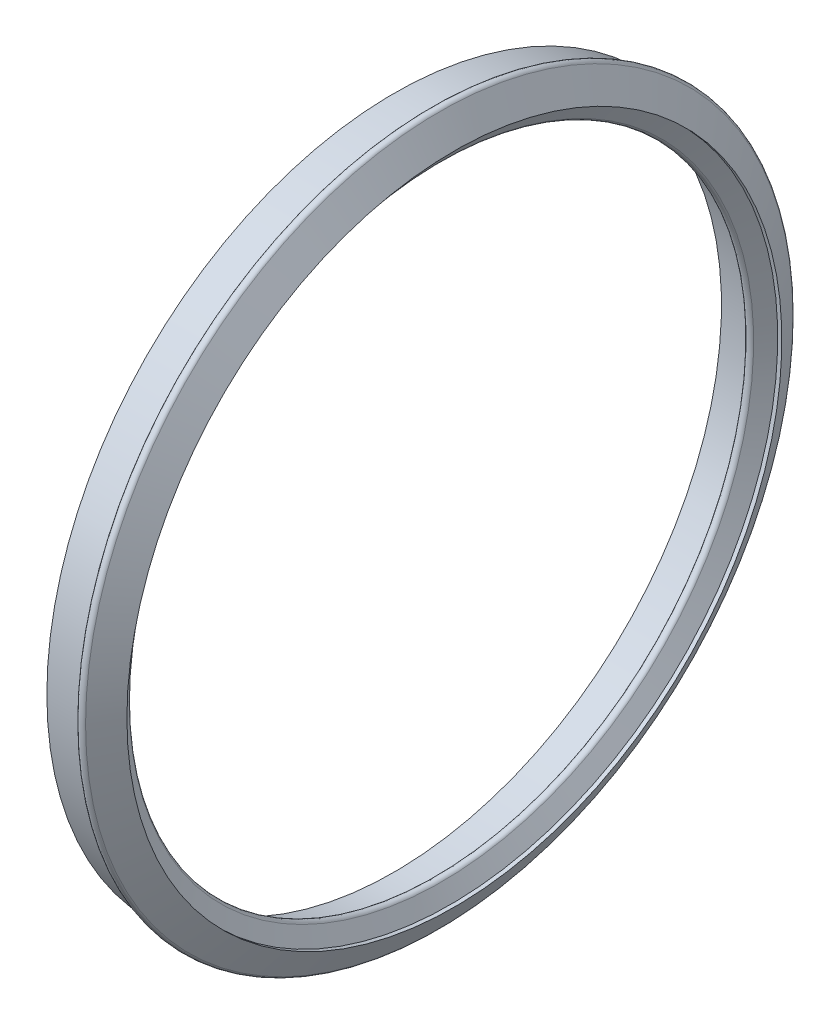
ISO-10303-21;
HEADER;
FILE_DESCRIPTION(('STEP AP214'),'2;1');
FILE_NAME('part.step','',(''),(''),'','','');
FILE_SCHEMA(('AUTOMOTIVE_DESIGN { 1 0 10303 214 1 1 1 1 }'));
ENDSEC;
DATA;
#1=APPLICATION_CONTEXT('core data for automotive mechanical design processes');
#2=APPLICATION_PROTOCOL_DEFINITION('international standard','automotive_design',2000,#1);
#3=PRODUCT_CONTEXT('',#1,'mechanical');
#4=PRODUCT('Part','Part','',(#3));
#5=PRODUCT_RELATED_PRODUCT_CATEGORY('part','',(#4));
#6=PRODUCT_DEFINITION_FORMATION('','',#4);
#7=PRODUCT_DEFINITION_CONTEXT('part definition',#1,'design');
#8=PRODUCT_DEFINITION('design','',#6,#7);
#9=PRODUCT_DEFINITION_SHAPE('','',#8);
#10=(LENGTH_UNIT() NAMED_UNIT(*) SI_UNIT(.MILLI.,.METRE.));
#11=(NAMED_UNIT(*) PLANE_ANGLE_UNIT() SI_UNIT($,.RADIAN.));
#12=(NAMED_UNIT(*) SI_UNIT($,.STERADIAN.) SOLID_ANGLE_UNIT());
#13=UNCERTAINTY_MEASURE_WITH_UNIT(LENGTH_MEASURE(1.E-05),#10,'distance_accuracy_value','');
#14=(GEOMETRIC_REPRESENTATION_CONTEXT(3) GLOBAL_UNCERTAINTY_ASSIGNED_CONTEXT((#13)) GLOBAL_UNIT_ASSIGNED_CONTEXT((#10,
#11,#12)) REPRESENTATION_CONTEXT('',''));
#15=CARTESIAN_POINT('',(0.,0.,0.));
#16=DIRECTION('',(0.,0.,1.));
#17=DIRECTION('',(1.,0.,0.));
#18=AXIS2_PLACEMENT_3D('',#15,#16,#17);
#19=CARTESIAN_POINT('',(1.72679491924318,4.10000000000003,0.));
#20=DIRECTION('',(1.,0.,0.));
#21=DIRECTION('',(0.,0.,-1.));
#22=AXIS2_PLACEMENT_3D('',#19,#20,#21);
#23=CONICAL_SURFACE('',#22,16.1999999999999,1.04719755119664);
#24=CARTESIAN_POINT('',(1.55358983848635,4.10000000000003,0.));
#25=DIRECTION('',(-1.,0.,0.));
#26=DIRECTION('',(0.,0.,1.));
#27=AXIS2_PLACEMENT_3D('',#24,#25,#26);
#28=CIRCLE('',#27,15.9);
#29=CARTESIAN_POINT('',(1.55358983848635,4.10000000000003,15.9));
#30=VERTEX_POINT('',#29);
#31=EDGE_CURVE('E10',#30,#30,#28,.T.);
#32=ORIENTED_EDGE('',*,*,#31,.F.);
#33=EDGE_LOOP('',(#32));
#34=FACE_BOUND('',#33,.T.);
#35=CARTESIAN_POINT('',(1.72679491924318,4.10000000000003,0.));
#36=DIRECTION('',(-1.,0.,0.));
#37=DIRECTION('',(0.,0.,1.));
#38=AXIS2_PLACEMENT_3D('',#35,#36,#37);
#39=CIRCLE('',#38,16.1999999999999);
#40=CARTESIAN_POINT('',(1.72679491924318,4.10000000000003,16.1999999999999));
#41=VERTEX_POINT('',#40);
#42=EDGE_CURVE('E73',#41,#41,#39,.T.);
#43=ORIENTED_EDGE('',*,*,#42,.T.);
#44=EDGE_LOOP('',(#43));
#45=FACE_BOUND('',#44,.T.);
#46=ADVANCED_FACE('F39',(#34,#45),#23,.T.);
#47=CARTESIAN_POINT('',(0.,4.10000000000003,0.));
#48=DIRECTION('',(-1.,0.,0.));
#49=DIRECTION('',(0.,0.,1.));
#50=AXIS2_PLACEMENT_3D('',#47,#48,#49);
#51=CYLINDRICAL_SURFACE('',#50,15.9);
#52=CARTESIAN_POINT('',(0.,4.10000000000003,0.));
#53=DIRECTION('',(-1.,0.,0.));
#54=DIRECTION('',(0.,0.,1.));
#55=AXIS2_PLACEMENT_3D('',#52,#53,#54);
#56=CIRCLE('',#55,15.9);
#57=CARTESIAN_POINT('',(0.,4.10000000000003,15.9));
#58=VERTEX_POINT('',#57);
#59=EDGE_CURVE('E45',#58,#58,#56,.T.);
#60=ORIENTED_EDGE('',*,*,#59,.F.);
#61=EDGE_LOOP('',(#60));
#62=FACE_BOUND('',#61,.T.);
#63=ORIENTED_EDGE('',*,*,#31,.T.);
#64=EDGE_LOOP('',(#63));
#65=FACE_BOUND('',#64,.T.);
#66=ADVANCED_FACE('F122',(#62,#65),#51,.T.);
#67=CARTESIAN_POINT('',(0.,20.,0.));
#68=DIRECTION('',(1.,0.,0.));
#69=DIRECTION('',(0.,0.,-1.));
#70=AXIS2_PLACEMENT_3D('',#67,#68,#69);
#71=PLANE('',#70);
#72=CARTESIAN_POINT('',(0.,4.10000000000003,0.));
#73=DIRECTION('',(-1.,0.,0.));
#74=DIRECTION('',(0.,0.,1.));
#75=AXIS2_PLACEMENT_3D('',#72,#73,#74);
#76=CIRCLE('',#75,15.);
#77=CARTESIAN_POINT('',(0.,4.10000000000003,15.));
#78=VERTEX_POINT('',#77);
#79=EDGE_CURVE('E49',#78,#78,#76,.T.);
#80=ORIENTED_EDGE('',*,*,#79,.F.);
#81=EDGE_LOOP('',(#80));
#82=FACE_BOUND('',#81,.T.);
#83=ORIENTED_EDGE('',*,*,#59,.T.);
#84=EDGE_LOOP('',(#83));
#85=FACE_BOUND('',#84,.T.);
#86=ADVANCED_FACE('F117',(#82,#85),#71,.F.);
#87=CARTESIAN_POINT('',(0.,4.10000000000003,0.));
#88=DIRECTION('',(-1.,0.,0.));
#89=DIRECTION('',(0.,0.,1.));
#90=AXIS2_PLACEMENT_3D('',#87,#88,#89);
#91=CYLINDRICAL_SURFACE('',#90,15.);
#92=CARTESIAN_POINT('',(1.42264973081044,4.10000000000003,0.));
#93=DIRECTION('',(-1.,0.,0.));
#94=DIRECTION('',(0.,0.,1.));
#95=AXIS2_PLACEMENT_3D('',#92,#93,#94);
#96=CIRCLE('',#95,15.);
#97=CARTESIAN_POINT('',(1.42264973081044,4.10000000000003,15.));
#98=VERTEX_POINT('',#97);
#99=EDGE_CURVE('E53',#98,#98,#96,.T.);
#100=ORIENTED_EDGE('',*,*,#99,.F.);
#101=EDGE_LOOP('',(#100));
#102=FACE_BOUND('',#101,.T.);
#103=ORIENTED_EDGE('',*,*,#79,.T.);
#104=EDGE_LOOP('',(#103));
#105=FACE_BOUND('',#104,.T.);
#106=ADVANCED_FACE('F111',(#102,#105),#91,.F.);
#107=CARTESIAN_POINT('',(1.42264973081044,4.10000000000003,0.));
#108=DIRECTION('',(-1.,0.,0.));
#109=DIRECTION('',(0.,0.,1.));
#110=AXIS2_PLACEMENT_3D('',#107,#108,#109);
#111=CONICAL_SURFACE('',#110,15.,1.0471975511966);
#112=CARTESIAN_POINT('',(1.82679491924318,4.10000000000003,0.));
#113=DIRECTION('',(-1.,0.,0.));
#114=DIRECTION('',(0.,0.,1.));
#115=AXIS2_PLACEMENT_3D('',#112,#113,#114);
#116=CIRCLE('',#115,14.3);
#117=CARTESIAN_POINT('',(1.82679491924318,4.10000000000003,14.3));
#118=VERTEX_POINT('',#117);
#119=EDGE_CURVE('E58',#118,#118,#116,.T.);
#120=ORIENTED_EDGE('',*,*,#119,.F.);
#121=EDGE_LOOP('',(#120));
#122=FACE_BOUND('',#121,.T.);
#123=ORIENTED_EDGE('',*,*,#99,.T.);
#124=EDGE_LOOP('',(#123));
#125=FACE_BOUND('',#124,.T.);
#126=ADVANCED_FACE('F105',(#122,#125),#111,.F.);
#127=CARTESIAN_POINT('',(2.00000000000012,4.10000000000003,0.));
#128=DIRECTION('',(-1.,0.,0.));
#129=DIRECTION('',(0.,0.,1.));
#130=AXIS2_PLACEMENT_3D('',#127,#128,#129);
#131=TOROIDAL_SURFACE('',#130,14.4,0.2);
#132=CARTESIAN_POINT('',(2.17320508075699,4.10000000000003,0.));
#133=DIRECTION('',(-1.,0.,0.));
#134=DIRECTION('',(0.,0.,1.));
#135=AXIS2_PLACEMENT_3D('',#132,#133,#134);
#136=CIRCLE('',#135,14.3);
#137=CARTESIAN_POINT('',(2.17320508075699,4.10000000000003,14.3));
#138=VERTEX_POINT('',#137);
#139=EDGE_CURVE('E61',#138,#138,#136,.T.);
#140=ORIENTED_EDGE('',*,*,#139,.F.);
#141=EDGE_LOOP('',(#140));
#142=FACE_BOUND('',#141,.T.);
#143=ORIENTED_EDGE('',*,*,#119,.T.);
#144=EDGE_LOOP('',(#143));
#145=FACE_BOUND('',#144,.T.);
#146=ADVANCED_FACE('F99',(#142,#145),#131,.T.);
#147=CARTESIAN_POINT('',(2.17320508075699,4.10000000000003,0.));
#148=DIRECTION('',(1.,0.,0.));
#149=DIRECTION('',(0.,0.,-1.));
#150=AXIS2_PLACEMENT_3D('',#147,#148,#149);
#151=CONICAL_SURFACE('',#150,14.3,1.04719755119666);
#152=CARTESIAN_POINT('',(2.57735026918969,4.10000000000003,0.));
#153=DIRECTION('',(-1.,0.,0.));
#154=DIRECTION('',(0.,0.,1.));
#155=AXIS2_PLACEMENT_3D('',#152,#153,#154);
#156=CIRCLE('',#155,15.);
#157=CARTESIAN_POINT('',(2.57735026918969,4.10000000000003,15.));
#158=VERTEX_POINT('',#157);
#159=EDGE_CURVE('E64',#158,#158,#156,.T.);
#160=ORIENTED_EDGE('',*,*,#159,.F.);
#161=EDGE_LOOP('',(#160));
#162=FACE_BOUND('',#161,.T.);
#163=ORIENTED_EDGE('',*,*,#139,.T.);
#164=EDGE_LOOP('',(#163));
#165=FACE_BOUND('',#164,.T.);
#166=ADVANCED_FACE('F93',(#162,#165),#151,.F.);
#167=CARTESIAN_POINT('',(0.,4.10000000000003,0.));
#168=DIRECTION('',(-1.,0.,0.));
#169=DIRECTION('',(0.,0.,1.));
#170=AXIS2_PLACEMENT_3D('',#167,#168,#169);
#171=CYLINDRICAL_SURFACE('',#170,15.);
#172=CARTESIAN_POINT('',(2.76602540378447,4.10000000000003,0.));
#173=DIRECTION('',(-1.,0.,0.));
#174=DIRECTION('',(0.,0.,1.));
#175=AXIS2_PLACEMENT_3D('',#172,#173,#174);
#176=CIRCLE('',#175,15.);
#177=CARTESIAN_POINT('',(2.76602540378447,4.10000000000003,15.));
#178=VERTEX_POINT('',#177);
#179=EDGE_CURVE('E67',#178,#178,#176,.T.);
#180=ORIENTED_EDGE('',*,*,#179,.F.);
#181=EDGE_LOOP('',(#180));
#182=FACE_BOUND('',#181,.T.);
#183=ORIENTED_EDGE('',*,*,#159,.T.);
#184=EDGE_LOOP('',(#183));
#185=FACE_BOUND('',#184,.T.);
#186=ADVANCED_FACE('F87',(#182,#185),#171,.F.);
#187=CARTESIAN_POINT('',(2.76602540378447,4.10000000000003,0.));
#188=DIRECTION('',(-1.,0.,0.));
#189=DIRECTION('',(0.,0.,1.));
#190=AXIS2_PLACEMENT_3D('',#187,#188,#189);
#191=CONICAL_SURFACE('',#190,15.,1.0471975511966);
#192=CARTESIAN_POINT('',(2.07320508075696,4.10000000000003,0.));
#193=DIRECTION('',(-1.,0.,0.));
#194=DIRECTION('',(0.,0.,1.));
#195=AXIS2_PLACEMENT_3D('',#192,#193,#194);
#196=CIRCLE('',#195,16.1999999999999);
#197=CARTESIAN_POINT('',(2.07320508075696,4.10000000000003,16.1999999999999));
#198=VERTEX_POINT('',#197);
#199=EDGE_CURVE('E70',#198,#198,#196,.T.);
#200=ORIENTED_EDGE('',*,*,#199,.F.);
#201=EDGE_LOOP('',(#200));
#202=FACE_BOUND('',#201,.T.);
#203=ORIENTED_EDGE('',*,*,#179,.T.);
#204=EDGE_LOOP('',(#203));
#205=FACE_BOUND('',#204,.T.);
#206=ADVANCED_FACE('F81',(#202,#205),#191,.T.);
#207=CARTESIAN_POINT('',(1.90000000000006,4.10000000000003,0.));
#208=DIRECTION('',(-1.,0.,0.));
#209=DIRECTION('',(0.,0.,1.));
#210=AXIS2_PLACEMENT_3D('',#207,#208,#209);
#211=TOROIDAL_SURFACE('',#210,16.0999999999999,0.200000000000006);
#212=ORIENTED_EDGE('',*,*,#42,.F.);
#213=EDGE_LOOP('',(#212));
#214=FACE_BOUND('',#213,.T.);
#215=ORIENTED_EDGE('',*,*,#199,.T.);
#216=EDGE_LOOP('',(#215));
#217=FACE_BOUND('',#216,.T.);
#218=ADVANCED_FACE('F78',(#214,#217),#211,.T.);
#219=CLOSED_SHELL('',(#46,#66,#86,#106,#126,#146,#166,#186,#206,#218));
#220=MANIFOLD_SOLID_BREP('B2',#219);
#221=ADVANCED_BREP_SHAPE_REPRESENTATION('',(#18,#220),#14);
#222=SHAPE_DEFINITION_REPRESENTATION(#9,#221);
ENDSEC;
END-ISO-10303-21;
